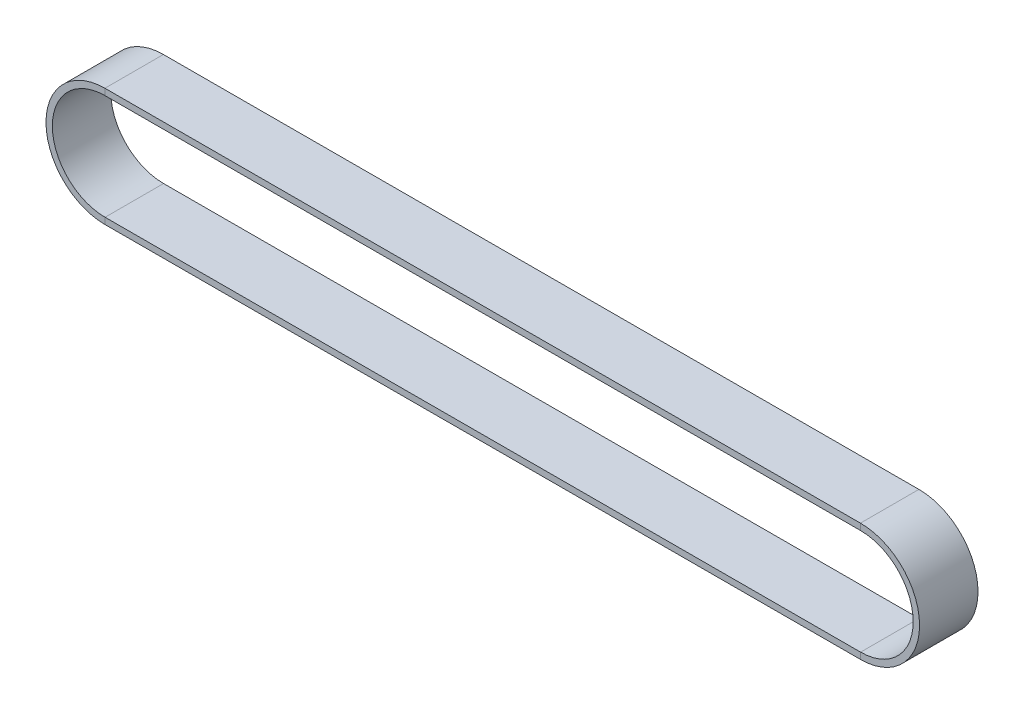
ISO-10303-21;
HEADER;
FILE_DESCRIPTION(('STEP AP214'),'2;1');
FILE_NAME('part.step','',(''),(''),'','','');
FILE_SCHEMA(('AUTOMOTIVE_DESIGN { 1 0 10303 214 1 1 1 1 }'));
ENDSEC;
DATA;
#1=APPLICATION_CONTEXT('core data for automotive mechanical design processes');
#2=APPLICATION_PROTOCOL_DEFINITION('international standard','automotive_design',2000,#1);
#3=PRODUCT_CONTEXT('',#1,'mechanical');
#4=PRODUCT('Part','Part','',(#3));
#5=PRODUCT_RELATED_PRODUCT_CATEGORY('part','',(#4));
#6=PRODUCT_DEFINITION_FORMATION('','',#4);
#7=PRODUCT_DEFINITION_CONTEXT('part definition',#1,'design');
#8=PRODUCT_DEFINITION('design','',#6,#7);
#9=PRODUCT_DEFINITION_SHAPE('','',#8);
#10=(LENGTH_UNIT() NAMED_UNIT(*) SI_UNIT(.MILLI.,.METRE.));
#11=(NAMED_UNIT(*) PLANE_ANGLE_UNIT() SI_UNIT($,.RADIAN.));
#12=(NAMED_UNIT(*) SI_UNIT($,.STERADIAN.) SOLID_ANGLE_UNIT());
#13=UNCERTAINTY_MEASURE_WITH_UNIT(LENGTH_MEASURE(1.E-05),#10,'distance_accuracy_value','');
#14=(GEOMETRIC_REPRESENTATION_CONTEXT(3) GLOBAL_UNCERTAINTY_ASSIGNED_CONTEXT((#13)) GLOBAL_UNIT_ASSIGNED_CONTEXT((#10,
#11,#12)) REPRESENTATION_CONTEXT('',''));
#15=CARTESIAN_POINT('',(0.,0.,0.));
#16=DIRECTION('',(0.,0.,1.));
#17=DIRECTION('',(1.,0.,0.));
#18=AXIS2_PLACEMENT_3D('',#15,#16,#17);
#19=CARTESIAN_POINT('',(0.02786966695935,-9.26105206469781,10.28192));
#20=DIRECTION('',(0.,0.,-1.));
#21=DIRECTION('',(-1.,0.,0.));
#22=AXIS2_PLACEMENT_3D('',#19,#20,#21);
#23=PLANE('',#22);
#24=DIRECTION('',(-1.57763196829956E-07,-0.999999999999988,0.));
#25=VECTOR('',#24,1.);
#26=CARTESIAN_POINT('',(0.027869666959368,-9.26105206469781,10.28192));
#27=LINE('',#26,#25);
#28=CARTESIAN_POINT('',(0.0278696669593903,-9.26105206469781,10.28192));
#29=VERTEX_POINT('',#28);
#30=CARTESIAN_POINT('',(0.0278694902646204,-10.3810520646978,10.28192));
#31=VERTEX_POINT('',#30);
#32=EDGE_CURVE('E146',#29,#31,#27,.T.);
#33=ORIENTED_EDGE('',*,*,#32,.F.);
#34=CARTESIAN_POINT('',(0.013935564007919,2.09687501974844E-05,10.28192));
#35=DIRECTION('',(0.,0.,-1.));
#36=DIRECTION('',(0.00150458668549716,-0.999998868108812,0.));
#37=AXIS2_PLACEMENT_3D('',#34,#35,#36);
#38=CIRCLE('',#37,9.26108351598683);
#39=CARTESIAN_POINT('',(5.57731963157932E-13,9.2610939999998,10.28192));
#40=VERTEX_POINT('',#39);
#41=EDGE_CURVE('E145',#29,#40,#38,.T.);
#42=ORIENTED_EDGE('',*,*,#41,.T.);
#43=DIRECTION('',(0.,1.,0.));
#44=VECTOR('',#43,1.);
#45=CARTESIAN_POINT('',(5.57731963157932E-13,9.2610939999998,10.28192));
#46=LINE('',#45,#44);
#47=CARTESIAN_POINT('',(6.25181856090333E-13,10.3810939999998,10.28192));
#48=VERTEX_POINT('',#47);
#49=EDGE_CURVE('E124',#40,#48,#46,.T.);
#50=ORIENTED_EDGE('',*,*,#49,.T.);
#51=CARTESIAN_POINT('',(0.013935564007919,2.09687501974844E-05,10.28192));
#52=DIRECTION('',(0.,0.,-1.));
#53=DIRECTION('',(0.0013422421420186,-0.99999909919261,0.));
#54=AXIS2_PLACEMENT_3D('',#51,#52,#53);
#55=CIRCLE('',#54,10.3810823848037);
#56=EDGE_CURVE('E150',#31,#48,#55,.T.);
#57=ORIENTED_EDGE('',*,*,#56,.F.);
#58=EDGE_LOOP('',(#33,#42,#50,#57));
#59=FACE_BOUND('',#58,.T.);
#60=ADVANCED_FACE('F30',(#59),#23,.F.);
#61=CARTESIAN_POINT('',(5.57731963157932E-13,9.2610939999998,10.28192));
#62=DIRECTION('',(0.,0.,-1.));
#63=DIRECTION('',(-1.,0.,0.));
#64=AXIS2_PLACEMENT_3D('',#61,#62,#63);
#65=PLANE('',#64);
#66=DIRECTION('',(0.99999886783222,0.00150477050678596,0.));
#67=VECTOR('',#66,1.);
#68=CARTESIAN_POINT('',(6.25181856090333E-13,10.3810939999998,10.28192));
#69=LINE('',#68,#67);
#70=CARTESIAN_POINT('',(132.903516671769,10.5810835185573,10.28192));
#71=VERTEX_POINT('',#70);
#72=EDGE_CURVE('E114',#48,#71,#69,.T.);
#73=ORIENTED_EDGE('',*,*,#72,.F.);
#74=ORIENTED_EDGE('',*,*,#49,.F.);
#75=DIRECTION('',(0.99999886783222,0.00150477050678596,0.));
#76=VECTOR('',#75,1.);
#77=CARTESIAN_POINT('',(5.57731963157932E-13,9.2610939999998,10.28192));
#78=LINE('',#77,#76);
#79=CARTESIAN_POINT('',(132.903516671769,9.4610835185573,10.28192));
#80=VERTEX_POINT('',#79);
#81=EDGE_CURVE('E127',#40,#80,#78,.T.);
#82=ORIENTED_EDGE('',*,*,#81,.T.);
#83=DIRECTION('',(0.,1.,0.));
#84=VECTOR('',#83,1.);
#85=CARTESIAN_POINT('',(132.903516671769,9.4610835185573,10.28192));
#86=LINE('',#85,#84);
#87=EDGE_CURVE('E142',#80,#71,#86,.T.);
#88=ORIENTED_EDGE('',*,*,#87,.T.);
#89=EDGE_LOOP('',(#73,#74,#82,#88));
#90=FACE_BOUND('',#89,.T.);
#91=ADVANCED_FACE('F126',(#90),#65,.F.);
#92=CARTESIAN_POINT('',(6.25181856090333E-13,10.3810939999998,0.));
#93=DIRECTION('',(0.00150477050678596,-0.99999886783222,0.));
#94=DIRECTION('',(0.99999886783222,0.00150477050678596,0.));
#95=AXIS2_PLACEMENT_3D('',#92,#93,#94);
#96=PLANE('',#95);
#97=DIRECTION('',(0.99999886783222,0.00150477050678596,0.));
#98=VECTOR('',#97,1.);
#99=CARTESIAN_POINT('',(6.25181856090333E-13,10.3810939999998,0.));
#100=LINE('',#99,#98);
#101=CARTESIAN_POINT('',(6.25181856090333E-13,10.3810939999998,0.));
#102=VERTEX_POINT('',#101);
#103=CARTESIAN_POINT('',(132.903516671769,10.5810835185573,0.));
#104=VERTEX_POINT('',#103);
#105=EDGE_CURVE('E108',#102,#104,#100,.T.);
#106=ORIENTED_EDGE('',*,*,#105,.F.);
#107=DIRECTION('',(0.,0.,-1.));
#108=VECTOR('',#107,1.);
#109=CARTESIAN_POINT('',(6.25181856090333E-13,10.3810939999998,0.));
#110=LINE('',#109,#108);
#111=EDGE_CURVE('E132',#48,#102,#110,.T.);
#112=ORIENTED_EDGE('',*,*,#111,.F.);
#113=ORIENTED_EDGE('',*,*,#72,.T.);
#114=DIRECTION('',(0.,0.,-1.));
#115=VECTOR('',#114,1.);
#116=CARTESIAN_POINT('',(132.903516671769,10.5810835185573,0.));
#117=LINE('',#116,#115);
#118=EDGE_CURVE('E183',#71,#104,#117,.T.);
#119=ORIENTED_EDGE('',*,*,#118,.T.);
#120=EDGE_LOOP('',(#106,#112,#113,#119));
#121=FACE_BOUND('',#120,.T.);
#122=ADVANCED_FACE('F209',(#121),#96,.F.);
#123=CARTESIAN_POINT('',(5.57731963157932E-13,9.2610939999998,0.));
#124=DIRECTION('',(0.,0.,1.));
#125=DIRECTION('',(1.,0.,0.));
#126=AXIS2_PLACEMENT_3D('',#123,#124,#125);
#127=PLANE('',#126);
#128=DIRECTION('',(0.99999886783222,0.00150477050678596,0.));
#129=VECTOR('',#128,1.);
#130=CARTESIAN_POINT('',(5.57731963157932E-13,9.2610939999998,0.));
#131=LINE('',#130,#129);
#132=CARTESIAN_POINT('',(5.57731963157932E-13,9.2610939999998,0.));
#133=VERTEX_POINT('',#132);
#134=CARTESIAN_POINT('',(132.903516671769,9.4610835185573,0.));
#135=VERTEX_POINT('',#134);
#136=EDGE_CURVE('E160',#133,#135,#131,.T.);
#137=ORIENTED_EDGE('',*,*,#136,.F.);
#138=DIRECTION('',(0.,-1.,0.));
#139=VECTOR('',#138,1.);
#140=CARTESIAN_POINT('',(5.57731963157932E-13,9.2610939999998,0.));
#141=LINE('',#140,#139);
#142=EDGE_CURVE('E153',#102,#133,#141,.T.);
#143=ORIENTED_EDGE('',*,*,#142,.F.);
#144=ORIENTED_EDGE('',*,*,#105,.T.);
#145=DIRECTION('',(0.,-1.,0.));
#146=VECTOR('',#145,1.);
#147=CARTESIAN_POINT('',(132.903516671769,9.4610835185573,0.));
#148=LINE('',#147,#146);
#149=EDGE_CURVE('E182',#104,#135,#148,.T.);
#150=ORIENTED_EDGE('',*,*,#149,.T.);
#151=EDGE_LOOP('',(#137,#143,#144,#150));
#152=FACE_BOUND('',#151,.T.);
#153=ADVANCED_FACE('F181',(#152),#127,.F.);
#154=CARTESIAN_POINT('',(5.57731963157932E-13,9.2610939999998,0.));
#155=DIRECTION('',(-0.00150477050678596,0.99999886783222,0.));
#156=DIRECTION('',(-0.99999886783222,-0.00150477050678596,0.));
#157=AXIS2_PLACEMENT_3D('',#154,#155,#156);
#158=PLANE('',#157);
#159=DIRECTION('',(0.,0.,1.));
#160=VECTOR('',#159,1.);
#161=CARTESIAN_POINT('',(132.903516671769,9.4610835185573,0.));
#162=LINE('',#161,#160);
#163=EDGE_CURVE('E140',#135,#80,#162,.T.);
#164=ORIENTED_EDGE('',*,*,#163,.T.);
#165=ORIENTED_EDGE('',*,*,#81,.F.);
#166=DIRECTION('',(0.,0.,1.));
#167=VECTOR('',#166,1.);
#168=CARTESIAN_POINT('',(5.57731963157932E-13,9.2610939999998,0.));
#169=LINE('',#168,#167);
#170=EDGE_CURVE('E139',#133,#40,#169,.T.);
#171=ORIENTED_EDGE('',*,*,#170,.F.);
#172=ORIENTED_EDGE('',*,*,#136,.T.);
#173=EDGE_LOOP('',(#164,#165,#171,#172));
#174=FACE_BOUND('',#173,.T.);
#175=ADVANCED_FACE('F137',(#174),#158,.F.);
#176=CARTESIAN_POINT('',(132.903516671769,9.4610835185573,10.28192));
#177=DIRECTION('',(0.,0.,-1.));
#178=DIRECTION('',(-1.,0.,0.));
#179=AXIS2_PLACEMENT_3D('',#176,#177,#178);
#180=PLANE('',#179);
#181=CARTESIAN_POINT('',(132.917452251552,0.200000003669868,10.28192));
#182=DIRECTION('',(0.,0.,-1.));
#183=DIRECTION('',(-0.0013424000689868,0.999999098980622,0.));
#184=AXIS2_PLACEMENT_3D('',#181,#182,#183);
#185=CIRCLE('',#184,10.3810928684533);
#186=CARTESIAN_POINT('',(132.931386193582,-10.181083513416,10.28192));
#187=VERTEX_POINT('',#186);
#188=EDGE_CURVE('E95',#71,#187,#185,.T.);
#189=ORIENTED_EDGE('',*,*,#188,.F.);
#190=ORIENTED_EDGE('',*,*,#87,.F.);
#191=CARTESIAN_POINT('',(132.917452251552,0.200000003669868,10.28192));
#192=DIRECTION('',(0.,0.,-1.));
#193=DIRECTION('',(-0.00150474444848527,0.999998867871432,0.));
#194=AXIS2_PLACEMENT_3D('',#191,#192,#193);
#195=CIRCLE('',#194,9.26109399963652);
#196=CARTESIAN_POINT('',(132.931386370277,-9.06108351341597,10.28192));
#197=VERTEX_POINT('',#196);
#198=EDGE_CURVE('E159',#80,#197,#195,.T.);
#199=ORIENTED_EDGE('',*,*,#198,.T.);
#200=DIRECTION('',(-1.5776319832919E-07,-0.999999999999988,0.));
#201=VECTOR('',#200,1.);
#202=CARTESIAN_POINT('',(132.931386370277,-9.06108351341597,10.28192));
#203=LINE('',#202,#201);
#204=EDGE_CURVE('E168',#197,#187,#203,.T.);
#205=ORIENTED_EDGE('',*,*,#204,.T.);
#206=EDGE_LOOP('',(#189,#190,#199,#205));
#207=FACE_BOUND('',#206,.T.);
#208=ADVANCED_FACE('F205',(#207),#180,.F.);
#209=CARTESIAN_POINT('',(132.917452251552,0.200000003669868,0.));
#210=DIRECTION('',(0.,0.,-1.));
#211=DIRECTION('',(-1.,0.,0.));
#212=AXIS2_PLACEMENT_3D('',#209,#210,#211);
#213=CYLINDRICAL_SURFACE('',#212,10.3810928684533);
#214=CARTESIAN_POINT('',(132.917452251552,0.200000003669868,0.));
#215=DIRECTION('',(0.,0.,-1.));
#216=DIRECTION('',(-0.0013424000689868,0.999999098980622,0.));
#217=AXIS2_PLACEMENT_3D('',#214,#215,#216);
#218=CIRCLE('',#217,10.3810928684533);
#219=CARTESIAN_POINT('',(132.931386193582,-10.181083513416,0.));
#220=VERTEX_POINT('',#219);
#221=EDGE_CURVE('E88',#104,#220,#218,.T.);
#222=ORIENTED_EDGE('',*,*,#221,.F.);
#223=ORIENTED_EDGE('',*,*,#118,.F.);
#224=ORIENTED_EDGE('',*,*,#188,.T.);
#225=DIRECTION('',(0.,0.,-1.));
#226=VECTOR('',#225,1.);
#227=CARTESIAN_POINT('',(132.931386193582,-10.181083513416,0.));
#228=LINE('',#227,#226);
#229=EDGE_CURVE('E166',#187,#220,#228,.T.);
#230=ORIENTED_EDGE('',*,*,#229,.T.);
#231=EDGE_LOOP('',(#222,#223,#224,#230));
#232=FACE_BOUND('',#231,.T.);
#233=ADVANCED_FACE('F208',(#232),#213,.T.);
#234=CARTESIAN_POINT('',(132.903516671769,9.4610835185573,0.));
#235=DIRECTION('',(0.,0.,1.));
#236=DIRECTION('',(1.,0.,0.));
#237=AXIS2_PLACEMENT_3D('',#234,#235,#236);
#238=PLANE('',#237);
#239=CARTESIAN_POINT('',(132.917452251552,0.200000003669868,0.));
#240=DIRECTION('',(0.,0.,-1.));
#241=DIRECTION('',(-0.00150474444848527,0.999998867871432,0.));
#242=AXIS2_PLACEMENT_3D('',#239,#240,#241);
#243=CIRCLE('',#242,9.26109399963652);
#244=CARTESIAN_POINT('',(132.931386370277,-9.06108351341597,0.));
#245=VERTEX_POINT('',#244);
#246=EDGE_CURVE('E79',#135,#245,#243,.T.);
#247=ORIENTED_EDGE('',*,*,#246,.F.);
#248=ORIENTED_EDGE('',*,*,#149,.F.);
#249=ORIENTED_EDGE('',*,*,#221,.T.);
#250=DIRECTION('',(1.5776319832919E-07,0.999999999999988,0.));
#251=VECTOR('',#250,1.);
#252=CARTESIAN_POINT('',(132.931386370277,-9.06108351341597,0.));
#253=LINE('',#252,#251);
#254=EDGE_CURVE('E163',#220,#245,#253,.T.);
#255=ORIENTED_EDGE('',*,*,#254,.T.);
#256=EDGE_LOOP('',(#247,#248,#249,#255));
#257=FACE_BOUND('',#256,.T.);
#258=ADVANCED_FACE('F227',(#257),#238,.F.);
#259=CARTESIAN_POINT('',(132.917452251552,0.200000003669868,0.));
#260=DIRECTION('',(0.,0.,-1.));
#261=DIRECTION('',(-1.,0.,0.));
#262=AXIS2_PLACEMENT_3D('',#259,#260,#261);
#263=CYLINDRICAL_SURFACE('',#262,9.26109399963652);
#264=DIRECTION('',(0.,0.,1.));
#265=VECTOR('',#264,1.);
#266=CARTESIAN_POINT('',(132.931386370277,-9.06108351341597,0.));
#267=LINE('',#266,#265);
#268=EDGE_CURVE('E161',#245,#197,#267,.T.);
#269=ORIENTED_EDGE('',*,*,#268,.T.);
#270=ORIENTED_EDGE('',*,*,#198,.F.);
#271=ORIENTED_EDGE('',*,*,#163,.F.);
#272=ORIENTED_EDGE('',*,*,#246,.T.);
#273=EDGE_LOOP('',(#269,#270,#271,#272));
#274=FACE_BOUND('',#273,.T.);
#275=ADVANCED_FACE('F219',(#274),#263,.F.);
#276=CARTESIAN_POINT('',(132.931386370277,-9.06108351341597,10.28192));
#277=DIRECTION('',(0.,0.,-1.));
#278=DIRECTION('',(-1.,0.,0.));
#279=AXIS2_PLACEMENT_3D('',#276,#277,#278);
#280=PLANE('',#279);
#281=DIRECTION('',(-0.999998868069605,-0.00150461274382795,0.));
#282=VECTOR('',#281,1.);
#283=CARTESIAN_POINT('',(132.931386193582,-10.181083513416,10.28192));
#284=LINE('',#283,#282);
#285=EDGE_CURVE('E190',#187,#31,#284,.T.);
#286=ORIENTED_EDGE('',*,*,#285,.F.);
#287=ORIENTED_EDGE('',*,*,#204,.F.);
#288=DIRECTION('',(-0.999998868069605,-0.00150461274382795,0.));
#289=VECTOR('',#288,1.);
#290=CARTESIAN_POINT('',(132.931386370277,-9.06108351341597,10.28192));
#291=LINE('',#290,#289);
#292=EDGE_CURVE('E162',#197,#29,#291,.T.);
#293=ORIENTED_EDGE('',*,*,#292,.T.);
#294=ORIENTED_EDGE('',*,*,#32,.T.);
#295=EDGE_LOOP('',(#286,#287,#293,#294));
#296=FACE_BOUND('',#295,.T.);
#297=ADVANCED_FACE('F217',(#296),#280,.F.);
#298=CARTESIAN_POINT('',(132.931386193582,-10.181083513416,0.));
#299=DIRECTION('',(-0.00150461274382795,0.999998868069605,0.));
#300=DIRECTION('',(-0.999998868069605,-0.00150461274382795,0.));
#301=AXIS2_PLACEMENT_3D('',#298,#299,#300);
#302=PLANE('',#301);
#303=DIRECTION('',(-0.999998868069605,-0.00150461274382795,0.));
#304=VECTOR('',#303,1.);
#305=CARTESIAN_POINT('',(132.931386193582,-10.181083513416,0.));
#306=LINE('',#305,#304);
#307=CARTESIAN_POINT('',(0.0278694902646204,-10.3810520646978,0.));
#308=VERTEX_POINT('',#307);
#309=EDGE_CURVE('E55',#220,#308,#306,.T.);
#310=ORIENTED_EDGE('',*,*,#309,.F.);
#311=ORIENTED_EDGE('',*,*,#229,.F.);
#312=ORIENTED_EDGE('',*,*,#285,.T.);
#313=DIRECTION('',(0.,0.,-1.));
#314=VECTOR('',#313,1.);
#315=CARTESIAN_POINT('',(0.0278694902645875,-10.3810520646978,0.));
#316=LINE('',#315,#314);
#317=EDGE_CURVE('E188',#31,#308,#316,.T.);
#318=ORIENTED_EDGE('',*,*,#317,.T.);
#319=EDGE_LOOP('',(#310,#311,#312,#318));
#320=FACE_BOUND('',#319,.T.);
#321=ADVANCED_FACE('F214',(#320),#302,.F.);
#322=CARTESIAN_POINT('',(132.931386370277,-9.06108351341597,0.));
#323=DIRECTION('',(0.,0.,1.));
#324=DIRECTION('',(1.,0.,0.));
#325=AXIS2_PLACEMENT_3D('',#322,#323,#324);
#326=PLANE('',#325);
#327=DIRECTION('',(-0.999998868069605,-0.00150461274382795,0.));
#328=VECTOR('',#327,1.);
#329=CARTESIAN_POINT('',(132.931386370277,-9.06108351341597,0.));
#330=LINE('',#329,#328);
#331=CARTESIAN_POINT('',(0.0278696669593903,-9.26105206469781,0.));
#332=VERTEX_POINT('',#331);
#333=EDGE_CURVE('E47',#245,#332,#330,.T.);
#334=ORIENTED_EDGE('',*,*,#333,.F.);
#335=ORIENTED_EDGE('',*,*,#254,.F.);
#336=ORIENTED_EDGE('',*,*,#309,.T.);
#337=DIRECTION('',(1.57763196829956E-07,0.999999999999988,0.));
#338=VECTOR('',#337,1.);
#339=CARTESIAN_POINT('',(0.027869666959368,-9.26105206469781,0.));
#340=LINE('',#339,#338);
#341=EDGE_CURVE('E174',#308,#332,#340,.T.);
#342=ORIENTED_EDGE('',*,*,#341,.T.);
#343=EDGE_LOOP('',(#334,#335,#336,#342));
#344=FACE_BOUND('',#343,.T.);
#345=ADVANCED_FACE('F225',(#344),#326,.F.);
#346=CARTESIAN_POINT('',(132.931386370277,-9.06108351341597,0.));
#347=DIRECTION('',(0.00150461274382795,-0.999998868069605,0.));
#348=DIRECTION('',(0.999998868069605,0.00150461274382795,0.));
#349=AXIS2_PLACEMENT_3D('',#346,#347,#348);
#350=PLANE('',#349);
#351=DIRECTION('',(0.,0.,1.));
#352=VECTOR('',#351,1.);
#353=CARTESIAN_POINT('',(0.027869666959368,-9.26105206469781,0.));
#354=LINE('',#353,#352);
#355=EDGE_CURVE('E34',#332,#29,#354,.T.);
#356=ORIENTED_EDGE('',*,*,#355,.T.);
#357=ORIENTED_EDGE('',*,*,#292,.F.);
#358=ORIENTED_EDGE('',*,*,#268,.F.);
#359=ORIENTED_EDGE('',*,*,#333,.T.);
#360=EDGE_LOOP('',(#356,#357,#358,#359));
#361=FACE_BOUND('',#360,.T.);
#362=ADVANCED_FACE('F175',(#361),#350,.F.);
#363=CARTESIAN_POINT('',(0.013935564007919,2.09687501974844E-05,0.));
#364=DIRECTION('',(0.,0.,-1.));
#365=DIRECTION('',(-1.,0.,0.));
#366=AXIS2_PLACEMENT_3D('',#363,#364,#365);
#367=CYLINDRICAL_SURFACE('',#366,10.3810823848037);
#368=ORIENTED_EDGE('',*,*,#56,.T.);
#369=ORIENTED_EDGE('',*,*,#111,.T.);
#370=CARTESIAN_POINT('',(0.013935564007919,2.09687501974844E-05,0.));
#371=DIRECTION('',(0.,0.,-1.));
#372=DIRECTION('',(0.0013422421420186,-0.99999909919261,0.));
#373=AXIS2_PLACEMENT_3D('',#370,#371,#372);
#374=CIRCLE('',#373,10.3810823848037);
#375=EDGE_CURVE('E39',#308,#102,#374,.T.);
#376=ORIENTED_EDGE('',*,*,#375,.F.);
#377=ORIENTED_EDGE('',*,*,#317,.F.);
#378=EDGE_LOOP('',(#368,#369,#376,#377));
#379=FACE_BOUND('',#378,.T.);
#380=ADVANCED_FACE('F211',(#379),#367,.T.);
#381=CARTESIAN_POINT('',(0.02786966695935,-9.26105206469781,0.));
#382=DIRECTION('',(0.,0.,1.));
#383=DIRECTION('',(1.,0.,0.));
#384=AXIS2_PLACEMENT_3D('',#381,#382,#383);
#385=PLANE('',#384);
#386=ORIENTED_EDGE('',*,*,#375,.T.);
#387=ORIENTED_EDGE('',*,*,#142,.T.);
#388=CARTESIAN_POINT('',(0.013935564007919,2.09687501974844E-05,0.));
#389=DIRECTION('',(0.,0.,-1.));
#390=DIRECTION('',(0.00150458668549716,-0.999998868108812,0.));
#391=AXIS2_PLACEMENT_3D('',#388,#389,#390);
#392=CIRCLE('',#391,9.26108351598683);
#393=EDGE_CURVE('E11',#332,#133,#392,.T.);
#394=ORIENTED_EDGE('',*,*,#393,.F.);
#395=ORIENTED_EDGE('',*,*,#341,.F.);
#396=EDGE_LOOP('',(#386,#387,#394,#395));
#397=FACE_BOUND('',#396,.T.);
#398=ADVANCED_FACE('F179',(#397),#385,.F.);
#399=CARTESIAN_POINT('',(0.013935564007919,2.09687501974844E-05,0.));
#400=DIRECTION('',(0.,0.,-1.));
#401=DIRECTION('',(-1.,0.,0.));
#402=AXIS2_PLACEMENT_3D('',#399,#400,#401);
#403=CYLINDRICAL_SURFACE('',#402,9.26108351598683);
#404=ORIENTED_EDGE('',*,*,#393,.T.);
#405=ORIENTED_EDGE('',*,*,#170,.T.);
#406=ORIENTED_EDGE('',*,*,#41,.F.);
#407=ORIENTED_EDGE('',*,*,#355,.F.);
#408=EDGE_LOOP('',(#404,#405,#406,#407));
#409=FACE_BOUND('',#408,.T.);
#410=ADVANCED_FACE('F32',(#409),#403,.F.);
#411=CLOSED_SHELL('',(#60,#91,#122,#153,#175,#208,#233,#258,#275,#297,#321,#345,#362,#380,#398,#410));
#412=MANIFOLD_SOLID_BREP('B2',#411);
#413=ADVANCED_BREP_SHAPE_REPRESENTATION('',(#18,#412),#14);
#414=SHAPE_DEFINITION_REPRESENTATION(#9,#413);
ENDSEC;
END-ISO-10303-21;
